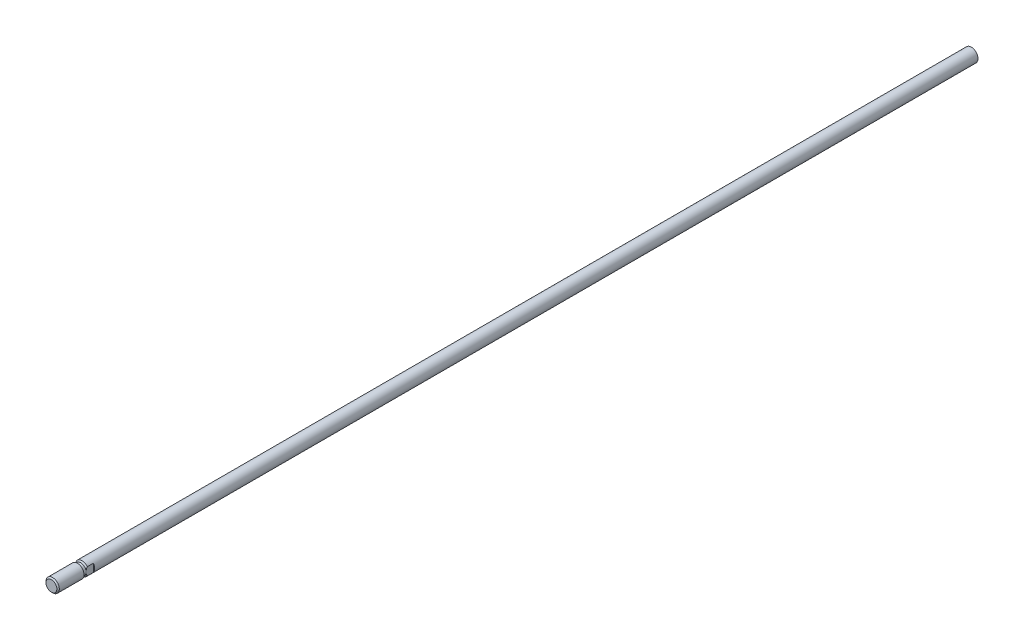
ISO-10303-21;
HEADER;
FILE_DESCRIPTION(('STEP AP214'),'2;1');
FILE_NAME('part.step','',(''),(''),'','','');
FILE_SCHEMA(('AUTOMOTIVE_DESIGN { 1 0 10303 214 1 1 1 1 }'));
ENDSEC;
DATA;
#1=APPLICATION_CONTEXT('core data for automotive mechanical design processes');
#2=APPLICATION_PROTOCOL_DEFINITION('international standard','automotive_design',2000,#1);
#3=PRODUCT_CONTEXT('',#1,'mechanical');
#4=PRODUCT('Part','Part','',(#3));
#5=PRODUCT_RELATED_PRODUCT_CATEGORY('part','',(#4));
#6=PRODUCT_DEFINITION_FORMATION('','',#4);
#7=PRODUCT_DEFINITION_CONTEXT('part definition',#1,'design');
#8=PRODUCT_DEFINITION('design','',#6,#7);
#9=PRODUCT_DEFINITION_SHAPE('','',#8);
#10=(LENGTH_UNIT() NAMED_UNIT(*) SI_UNIT(.MILLI.,.METRE.));
#11=(NAMED_UNIT(*) PLANE_ANGLE_UNIT() SI_UNIT($,.RADIAN.));
#12=(NAMED_UNIT(*) SI_UNIT($,.STERADIAN.) SOLID_ANGLE_UNIT());
#13=UNCERTAINTY_MEASURE_WITH_UNIT(LENGTH_MEASURE(1.E-05),#10,'distance_accuracy_value','');
#14=(GEOMETRIC_REPRESENTATION_CONTEXT(3) GLOBAL_UNCERTAINTY_ASSIGNED_CONTEXT((#13)) GLOBAL_UNIT_ASSIGNED_CONTEXT((#10,
#11,#12)) REPRESENTATION_CONTEXT('',''));
#15=CARTESIAN_POINT('',(0.,0.,0.));
#16=DIRECTION('',(0.,0.,1.));
#17=DIRECTION('',(1.,0.,0.));
#18=AXIS2_PLACEMENT_3D('',#15,#16,#17);
#19=CARTESIAN_POINT('',(-5.10028127481731,-2.99999999999999,12.5));
#20=CARTESIAN_POINT('',(-5.00999999999999,-2.99999999999999,12.5));
#21=CARTESIAN_POINT('',(-4.99999999999999,-2.99999999999999,12.5));
#22=CARTESIAN_POINT('',(-4.,-2.99999999999999,12.5));
#23=B_SPLINE_CURVE_WITH_KNOTS('',1,(#19,#20,#21,#22),.UNSPECIFIED.,.F.,.F.,(2,1,1,2),
(-0.100281274817329,-0.01,0.,1.),.UNSPECIFIED.);
#24=DIRECTION('',(0.,1.,0.));
#25=VECTOR('',#24,1.);
#26=SURFACE_OF_LINEAR_EXTRUSION('',#23,#25);
#27=CARTESIAN_POINT('',(0.,0.,12.5));
#28=DIRECTION('',(0.,0.,1.));
#29=DIRECTION('',(1.,0.,0.));
#30=AXIS2_PLACEMENT_3D('',#27,#28,#29);
#31=CIRCLE('',#30,5.);
#32=CARTESIAN_POINT('',(-4.,-2.99999999999999,12.5));
#33=VERTEX_POINT('',#32);
#34=CARTESIAN_POINT('',(-4.,2.99999999999999,12.5));
#35=VERTEX_POINT('',#34);
#36=EDGE_CURVE('E20',#33,#35,#31,.F.);
#37=ORIENTED_EDGE('',*,*,#36,.F.);
#38=DIRECTION('',(0.,-1.,0.));
#39=VECTOR('',#38,1.);
#40=CARTESIAN_POINT('',(-4.,0.,12.5));
#41=LINE('',#40,#39);
#42=EDGE_CURVE('E75',#35,#33,#41,.T.);
#43=ORIENTED_EDGE('',*,*,#42,.F.);
#44=EDGE_LOOP('',(#37,#43));
#45=FACE_BOUND('',#44,.T.);
#46=ADVANCED_FACE('F16',(#45),#26,.T.);
#47=CARTESIAN_POINT('',(4.,-2.99999999999999,12.5));
#48=CARTESIAN_POINT('',(4.99999999999999,-2.99999999999999,12.5));
#49=CARTESIAN_POINT('',(5.00999999999999,-2.99999999999999,12.5));
#50=CARTESIAN_POINT('',(5.10028127481732,-2.99999999999999,12.5));
#51=B_SPLINE_CURVE_WITH_KNOTS('',1,(#47,#48,#49,#50),.UNSPECIFIED.,.F.,.F.,(2,1,1,2),(0.,1.,
1.01,1.10028127481733),.UNSPECIFIED.);
#52=DIRECTION('',(0.,1.,0.));
#53=VECTOR('',#52,1.);
#54=SURFACE_OF_LINEAR_EXTRUSION('',#51,#53);
#55=CARTESIAN_POINT('',(0.,0.,12.5));
#56=DIRECTION('',(0.,0.,1.));
#57=DIRECTION('',(1.,0.,0.));
#58=AXIS2_PLACEMENT_3D('',#55,#56,#57);
#59=CIRCLE('',#58,5.);
#60=CARTESIAN_POINT('',(4.,2.99999999999999,12.5));
#61=VERTEX_POINT('',#60);
#62=CARTESIAN_POINT('',(4.,-2.99999999999999,12.5));
#63=VERTEX_POINT('',#62);
#64=EDGE_CURVE('E204',#61,#63,#59,.F.);
#65=ORIENTED_EDGE('',*,*,#64,.F.);
#66=DIRECTION('',(0.,1.,0.));
#67=VECTOR('',#66,1.);
#68=CARTESIAN_POINT('',(4.,0.,12.5));
#69=LINE('',#68,#67);
#70=EDGE_CURVE('E104',#63,#61,#69,.T.);
#71=ORIENTED_EDGE('',*,*,#70,.F.);
#72=EDGE_LOOP('',(#65,#71));
#73=FACE_BOUND('',#72,.T.);
#74=ADVANCED_FACE('F114',(#73),#54,.T.);
#75=CARTESIAN_POINT('',(5.06000210822772,4.99999999999999,-651.));
#76=DIRECTION('',(0.,0.,-1.));
#77=DIRECTION('',(0.,-1.,0.));
#78=AXIS2_PLACEMENT_3D('',#75,#76,#77);
#79=PLANE('',#78);
#80=CARTESIAN_POINT('',(0.,0.,-651.));
#81=DIRECTION('',(0.,0.,1.));
#82=DIRECTION('',(1.,0.,0.));
#83=AXIS2_PLACEMENT_3D('',#80,#81,#82);
#84=CIRCLE('',#83,5.);
#85=CARTESIAN_POINT('',(5.,0.,-651.));
#86=VERTEX_POINT('',#85);
#87=EDGE_CURVE('E145',#86,#86,#84,.T.);
#88=ORIENTED_EDGE('',*,*,#87,.F.);
#89=EDGE_LOOP('',(#88));
#90=FACE_BOUND('',#89,.T.);
#91=ADVANCED_FACE('F117',(#90),#79,.T.);
#92=CARTESIAN_POINT('',(-4.,-3.,18.1));
#93=DIRECTION('',(-1.,0.,0.));
#94=DIRECTION('',(0.,1.,0.));
#95=AXIS2_PLACEMENT_3D('',#92,#93,#94);
#96=PLANE('',#95);
#97=DIRECTION('',(0.,0.,-1.));
#98=VECTOR('',#97,1.);
#99=CARTESIAN_POINT('',(-4.,-2.99999999999999,-316.96));
#100=LINE('',#99,#98);
#101=CARTESIAN_POINT('',(-4.,-2.99999999999999,17.0799999999999));
#102=VERTEX_POINT('',#101);
#103=EDGE_CURVE('E80',#102,#33,#100,.T.);
#104=ORIENTED_EDGE('',*,*,#103,.F.);
#105=CARTESIAN_POINT('',(-4.,-0.803990049689661,18.));
#106=CARTESIAN_POINT('',(-4.,-0.957111448979984,17.9698555146944));
#107=CARTESIAN_POINT('',(-4.,-1.10840660638674,17.9317202771459));
#108=CARTESIAN_POINT('',(-4.,-1.40666504289202,17.8422446055734));
#109=CARTESIAN_POINT('',(-4.,-1.55363824050656,17.7909375518835));
#110=CARTESIAN_POINT('',(-4.,-1.84204129733348,17.678225960682));
#111=CARTESIAN_POINT('',(-4.,-1.98350914114274,17.6169164540391));
#112=CARTESIAN_POINT('',(-4.,-2.26263332343884,17.4860572225992));
#113=CARTESIAN_POINT('',(-4.,-2.40028783630364,17.4165036322937));
#114=CARTESIAN_POINT('',(-4.,-2.61449057624326,17.3018001479764));
#115=CARTESIAN_POINT('',(-4.,-2.69220805886646,17.2588026968617));
#116=CARTESIAN_POINT('',(-4.,-2.84678216232171,17.1708112513772));
#117=CARTESIAN_POINT('',(-4.,-2.92363591149713,17.1258122063226));
#118=CARTESIAN_POINT('',(-4.,-3.00000000000003,17.08));
#119=B_SPLINE_CURVE_WITH_KNOTS('',3,(#105,#106,#107,#108,#109,#110,#111,#112,#113,#114,#115,
#116,#117,#118),.UNSPECIFIED.,.F.,.F.,(4,2,2,2,2,2,4),(0.,0.467610349242256,0.934047169800779,
1.39628615872664,1.85874274734352,2.12517735583835,2.39232733289763),.UNSPECIFIED.);
#120=CARTESIAN_POINT('',(-4.,-0.80399004968966,18.));
#121=VERTEX_POINT('',#120);
#122=EDGE_CURVE('E130',#121,#102,#119,.T.);
#123=ORIENTED_EDGE('',*,*,#122,.F.);
#124=DIRECTION('',(0.,0.,-1.));
#125=VECTOR('',#124,1.);
#126=CARTESIAN_POINT('',(-4.,-0.80399004968966,18.1));
#127=LINE('',#126,#125);
#128=CARTESIAN_POINT('',(-4.,-0.803990049689667,18.1));
#129=VERTEX_POINT('',#128);
#130=EDGE_CURVE('E100',#121,#129,#127,.F.);
#131=ORIENTED_EDGE('',*,*,#130,.T.);
#132=DIRECTION('',(0.,1.,0.));
#133=VECTOR('',#132,1.);
#134=CARTESIAN_POINT('',(-4.,-0.80399004968966,18.1));
#135=LINE('',#134,#133);
#136=CARTESIAN_POINT('',(-4.,0.803990049689667,18.1));
#137=VERTEX_POINT('',#136);
#138=EDGE_CURVE('E144',#137,#129,#135,.F.);
#139=ORIENTED_EDGE('',*,*,#138,.F.);
#140=DIRECTION('',(0.,0.,-1.));
#141=VECTOR('',#140,1.);
#142=CARTESIAN_POINT('',(-4.,0.80399004968966,18.1));
#143=LINE('',#142,#141);
#144=CARTESIAN_POINT('',(-4.,0.803990049689661,18.));
#145=VERTEX_POINT('',#144);
#146=EDGE_CURVE('E81',#137,#145,#143,.T.);
#147=ORIENTED_EDGE('',*,*,#146,.T.);
#148=CARTESIAN_POINT('',(-4.,3.,17.0799999999999));
#149=CARTESIAN_POINT('',(-4.,2.91433318955761,17.1313884617042));
#150=CARTESIAN_POINT('',(-4.,2.82804651332608,17.1817624196025));
#151=CARTESIAN_POINT('',(-4.,2.65408101451074,17.2801077499734));
#152=CARTESIAN_POINT('',(-4.,2.5664017630611,17.3280783626319));
#153=CARTESIAN_POINT('',(-4.,2.3902024009373,17.4208683269221));
#154=CARTESIAN_POINT('',(-4.,2.30169320984052,17.465708251827));
#155=CARTESIAN_POINT('',(-4.,2.12311651376085,17.5521398631163));
#156=CARTESIAN_POINT('',(-4.,2.03304902327721,17.5937315797039));
#157=CARTESIAN_POINT('',(-4.,1.75985168179281,17.7130582155985));
#158=CARTESIAN_POINT('',(-4.,1.57412824469786,17.7851279795312));
#159=CARTESIAN_POINT('',(-4.,1.19469510076659,17.9092721171055));
#160=CARTESIAN_POINT('',(-4.,1.00093669700268,17.9611955066744));
#161=CARTESIAN_POINT('',(-4.,0.803990049689665,18.));
#162=B_SPLINE_CURVE_WITH_KNOTS('',3,(#148,#149,#150,#151,#152,#153,#154,#155,#156,#157,#158,
#159,#160,#161),.UNSPECIFIED.,.F.,.F.,(4,2,2,2,2,2,4),(0.,0.299699796219322,0.599493751801352,
0.897083854470931,1.19467118968738,1.79121084839557,2.39213860279033),.UNSPECIFIED.);
#163=CARTESIAN_POINT('',(-4.,2.99999999999999,17.0799999999999));
#164=VERTEX_POINT('',#163);
#165=EDGE_CURVE('E89',#164,#145,#162,.T.);
#166=ORIENTED_EDGE('',*,*,#165,.F.);
#167=DIRECTION('',(0.,0.,1.));
#168=VECTOR('',#167,1.);
#169=CARTESIAN_POINT('',(-4.,2.99999999999999,-316.96));
#170=LINE('',#169,#168);
#171=EDGE_CURVE('E85',#35,#164,#170,.T.);
#172=ORIENTED_EDGE('',*,*,#171,.F.);
#173=ORIENTED_EDGE('',*,*,#42,.T.);
#174=EDGE_LOOP('',(#104,#123,#131,#139,#147,#166,#172,#173));
#175=FACE_BOUND('',#174,.T.);
#176=ADVANCED_FACE('F86',(#175),#96,.T.);
#177=CARTESIAN_POINT('',(4.,3.,18.1));
#178=DIRECTION('',(1.,0.,0.));
#179=DIRECTION('',(0.,-1.,0.));
#180=AXIS2_PLACEMENT_3D('',#177,#178,#179);
#181=PLANE('',#180);
#182=DIRECTION('',(0.,0.,-1.));
#183=VECTOR('',#182,1.);
#184=CARTESIAN_POINT('',(4.,2.99999999999999,-316.96));
#185=LINE('',#184,#183);
#186=CARTESIAN_POINT('',(4.,2.99999999999999,17.0799999999999));
#187=VERTEX_POINT('',#186);
#188=EDGE_CURVE('E106',#187,#61,#185,.T.);
#189=ORIENTED_EDGE('',*,*,#188,.F.);
#190=CARTESIAN_POINT('',(4.,0.80399004968966,18.));
#191=CARTESIAN_POINT('',(4.,0.957111448979982,17.9698555146944));
#192=CARTESIAN_POINT('',(4.,1.10840660638673,17.9317202771459));
#193=CARTESIAN_POINT('',(4.,1.40666504289201,17.8422446055734));
#194=CARTESIAN_POINT('',(4.,1.55363824050656,17.7909375518835));
#195=CARTESIAN_POINT('',(4.,1.84204129733348,17.678225960682));
#196=CARTESIAN_POINT('',(4.,1.98350914114274,17.6169164540391));
#197=CARTESIAN_POINT('',(4.,2.26263332343884,17.4860572225992));
#198=CARTESIAN_POINT('',(4.,2.40028783630364,17.4165036322937));
#199=CARTESIAN_POINT('',(4.,2.61449057624326,17.3018001479764));
#200=CARTESIAN_POINT('',(4.,2.69220805886646,17.2588026968617));
#201=CARTESIAN_POINT('',(4.,2.84678216232171,17.1708112513772));
#202=CARTESIAN_POINT('',(4.,2.92363591149713,17.1258122063226));
#203=CARTESIAN_POINT('',(4.,3.00000000000002,17.08));
#204=B_SPLINE_CURVE_WITH_KNOTS('',3,(#190,#191,#192,#193,#194,#195,#196,#197,#198,#199,#200,
#201,#202,#203),.UNSPECIFIED.,.F.,.F.,(4,2,2,2,2,2,4),(0.,0.467610349242256,0.934047169800778,
1.39628615872664,1.85874274734352,2.12517735583835,2.39232733289763),.UNSPECIFIED.);
#205=CARTESIAN_POINT('',(4.,0.80399004968966,18.));
#206=VERTEX_POINT('',#205);
#207=EDGE_CURVE('E158',#206,#187,#204,.T.);
#208=ORIENTED_EDGE('',*,*,#207,.F.);
#209=DIRECTION('',(0.,0.,-1.));
#210=VECTOR('',#209,1.);
#211=CARTESIAN_POINT('',(4.,0.80399004968966,18.1));
#212=LINE('',#211,#210);
#213=CARTESIAN_POINT('',(4.,0.803990049689667,18.1));
#214=VERTEX_POINT('',#213);
#215=EDGE_CURVE('E35',#206,#214,#212,.F.);
#216=ORIENTED_EDGE('',*,*,#215,.T.);
#217=DIRECTION('',(0.,1.,0.));
#218=VECTOR('',#217,1.);
#219=CARTESIAN_POINT('',(4.,-0.80399004968966,18.1));
#220=LINE('',#219,#218);
#221=CARTESIAN_POINT('',(4.,-0.803990049689667,18.1));
#222=VERTEX_POINT('',#221);
#223=EDGE_CURVE('E166',#222,#214,#220,.T.);
#224=ORIENTED_EDGE('',*,*,#223,.F.);
#225=DIRECTION('',(0.,0.,-1.));
#226=VECTOR('',#225,1.);
#227=CARTESIAN_POINT('',(4.,-0.80399004968966,18.1));
#228=LINE('',#227,#226);
#229=CARTESIAN_POINT('',(4.,-0.80399004968966,18.));
#230=VERTEX_POINT('',#229);
#231=EDGE_CURVE('E107',#222,#230,#228,.T.);
#232=ORIENTED_EDGE('',*,*,#231,.T.);
#233=CARTESIAN_POINT('',(4.,-3.,17.0799999999999));
#234=CARTESIAN_POINT('',(4.,-2.91433318955761,17.1313884617042));
#235=CARTESIAN_POINT('',(4.,-2.82804651332608,17.1817624196025));
#236=CARTESIAN_POINT('',(4.,-2.65408101451074,17.2801077499734));
#237=CARTESIAN_POINT('',(4.,-2.5664017630611,17.3280783626319));
#238=CARTESIAN_POINT('',(4.,-2.3902024009373,17.4208683269221));
#239=CARTESIAN_POINT('',(4.,-2.30169320984052,17.465708251827));
#240=CARTESIAN_POINT('',(4.,-2.12311651376084,17.5521398631163));
#241=CARTESIAN_POINT('',(4.,-2.03304902327721,17.5937315797039));
#242=CARTESIAN_POINT('',(4.,-1.75985168179281,17.7130582155985));
#243=CARTESIAN_POINT('',(4.,-1.57412824469786,17.7851279795312));
#244=CARTESIAN_POINT('',(4.,-1.19469510076659,17.9092721171055));
#245=CARTESIAN_POINT('',(4.,-1.00093669700268,17.9611955066744));
#246=CARTESIAN_POINT('',(4.,-0.803990049689663,18.));
#247=B_SPLINE_CURVE_WITH_KNOTS('',3,(#233,#234,#235,#236,#237,#238,#239,#240,#241,#242,#243,
#244,#245,#246),.UNSPECIFIED.,.F.,.F.,(4,2,2,2,2,2,4),(0.,0.299699796219322,0.599493751801353,
0.897083854470931,1.19467118968738,1.79121084839557,2.39213860279033),.UNSPECIFIED.);
#248=CARTESIAN_POINT('',(4.,-2.99999999999999,17.0799999999999));
#249=VERTEX_POINT('',#248);
#250=EDGE_CURVE('E169',#249,#230,#247,.T.);
#251=ORIENTED_EDGE('',*,*,#250,.F.);
#252=DIRECTION('',(0.,0.,1.));
#253=VECTOR('',#252,1.);
#254=CARTESIAN_POINT('',(4.,-2.99999999999999,-316.96));
#255=LINE('',#254,#253);
#256=EDGE_CURVE('E98',#63,#249,#255,.T.);
#257=ORIENTED_EDGE('',*,*,#256,.F.);
#258=ORIENTED_EDGE('',*,*,#70,.T.);
#259=EDGE_LOOP('',(#189,#208,#216,#224,#232,#251,#257,#258));
#260=FACE_BOUND('',#259,.T.);
#261=ADVANCED_FACE('F125',(#260),#181,.T.);
#262=CARTESIAN_POINT('',(0.,0.,17.0799999999999));
#263=DIRECTION('',(0.,0.,1.));
#264=DIRECTION('',(1.,0.,0.));
#265=AXIS2_PLACEMENT_3D('',#262,#263,#264);
#266=CYLINDRICAL_SURFACE('',#265,5.);
#267=ORIENTED_EDGE('',*,*,#171,.T.);
#268=CARTESIAN_POINT('',(0.,0.,17.0799999999999));
#269=DIRECTION('',(0.,0.,1.));
#270=DIRECTION('',(0.,1.,0.));
#271=AXIS2_PLACEMENT_3D('',#268,#269,#270);
#272=CIRCLE('',#271,5.);
#273=EDGE_CURVE('E165',#187,#164,#272,.T.);
#274=ORIENTED_EDGE('',*,*,#273,.F.);
#275=ORIENTED_EDGE('',*,*,#188,.T.);
#276=ORIENTED_EDGE('',*,*,#64,.T.);
#277=ORIENTED_EDGE('',*,*,#256,.T.);
#278=CARTESIAN_POINT('',(0.,0.,17.0799999999999));
#279=DIRECTION('',(0.,0.,1.));
#280=DIRECTION('',(0.,1.,0.));
#281=AXIS2_PLACEMENT_3D('',#278,#279,#280);
#282=CIRCLE('',#281,5.);
#283=EDGE_CURVE('E175',#102,#249,#282,.T.);
#284=ORIENTED_EDGE('',*,*,#283,.F.);
#285=ORIENTED_EDGE('',*,*,#103,.T.);
#286=ORIENTED_EDGE('',*,*,#36,.T.);
#287=EDGE_LOOP('',(#267,#274,#275,#276,#277,#284,#285,#286));
#288=FACE_BOUND('',#287,.T.);
#289=ORIENTED_EDGE('',*,*,#87,.T.);
#290=EDGE_LOOP('',(#289));
#291=FACE_BOUND('',#290,.T.);
#292=ADVANCED_FACE('F93',(#288,#291),#266,.T.);
#293=CARTESIAN_POINT('',(-4.,-0.80399004968966,18.1));
#294=CARTESIAN_POINT('',(-4.08,-0.80399004968966,18.1));
#295=CARTESIAN_POINT('',(-4.0808,-0.80399004968966,18.1));
#296=B_SPLINE_CURVE_WITH_KNOTS('',1,(#293,#294,#295),.UNSPECIFIED.,.F.,.F.,(2,1,2),(0.,1.,1.01),.UNSPECIFIED.);
#297=DIRECTION('',(0.,1.,0.));
#298=VECTOR('',#297,1.);
#299=SURFACE_OF_LINEAR_EXTRUSION('',#296,#298);
#300=CARTESIAN_POINT('',(0.,0.,18.1));
#301=DIRECTION('',(0.,0.,1.));
#302=DIRECTION('',(1.,0.,0.));
#303=AXIS2_PLACEMENT_3D('',#300,#301,#302);
#304=CIRCLE('',#303,4.08);
#305=EDGE_CURVE('E167',#137,#129,#304,.T.);
#306=ORIENTED_EDGE('',*,*,#305,.F.);
#307=ORIENTED_EDGE('',*,*,#138,.T.);
#308=EDGE_LOOP('',(#306,#307));
#309=FACE_BOUND('',#308,.T.);
#310=ADVANCED_FACE('F180',(#309),#299,.T.);
#311=CARTESIAN_POINT('',(0.,0.,18.));
#312=DIRECTION('',(0.,0.,-1.));
#313=DIRECTION('',(-1.,0.,0.));
#314=AXIS2_PLACEMENT_3D('',#311,#312,#313);
#315=CONICAL_SURFACE('',#314,4.08,0.785398163397408);
#316=ORIENTED_EDGE('',*,*,#250,.T.);
#317=CARTESIAN_POINT('',(0.,0.,18.));
#318=DIRECTION('',(0.,0.,1.));
#319=DIRECTION('',(0.,1.,0.));
#320=AXIS2_PLACEMENT_3D('',#317,#318,#319);
#321=CIRCLE('',#320,4.08);
#322=EDGE_CURVE('E211',#121,#230,#321,.T.);
#323=ORIENTED_EDGE('',*,*,#322,.F.);
#324=ORIENTED_EDGE('',*,*,#122,.T.);
#325=ORIENTED_EDGE('',*,*,#283,.T.);
#326=EDGE_LOOP('',(#316,#323,#324,#325));
#327=FACE_BOUND('',#326,.T.);
#328=ADVANCED_FACE('F176',(#327),#315,.T.);
#329=CARTESIAN_POINT('',(4.0808,-0.80399004968966,18.1));
#330=CARTESIAN_POINT('',(4.08,-0.80399004968966,18.1));
#331=CARTESIAN_POINT('',(4.,-0.80399004968966,18.1));
#332=B_SPLINE_CURVE_WITH_KNOTS('',1,(#329,#330,#331),.UNSPECIFIED.,.F.,.F.,(2,1,2),(-0.01,0.,
1.),.UNSPECIFIED.);
#333=DIRECTION('',(0.,1.,0.));
#334=VECTOR('',#333,1.);
#335=SURFACE_OF_LINEAR_EXTRUSION('',#332,#334);
#336=CARTESIAN_POINT('',(0.,0.,18.1));
#337=DIRECTION('',(0.,0.,1.));
#338=DIRECTION('',(1.,0.,0.));
#339=AXIS2_PLACEMENT_3D('',#336,#337,#338);
#340=CIRCLE('',#339,4.08);
#341=EDGE_CURVE('E217',#222,#214,#340,.T.);
#342=ORIENTED_EDGE('',*,*,#341,.F.);
#343=ORIENTED_EDGE('',*,*,#223,.T.);
#344=EDGE_LOOP('',(#342,#343));
#345=FACE_BOUND('',#344,.T.);
#346=ADVANCED_FACE('F152',(#345),#335,.T.);
#347=CARTESIAN_POINT('',(0.,0.,18.));
#348=DIRECTION('',(0.,0.,-1.));
#349=DIRECTION('',(-1.,0.,0.));
#350=AXIS2_PLACEMENT_3D('',#347,#348,#349);
#351=CONICAL_SURFACE('',#350,4.08,0.785398163397408);
#352=ORIENTED_EDGE('',*,*,#207,.T.);
#353=ORIENTED_EDGE('',*,*,#273,.T.);
#354=ORIENTED_EDGE('',*,*,#165,.T.);
#355=CARTESIAN_POINT('',(0.,0.,18.));
#356=DIRECTION('',(0.,0.,1.));
#357=DIRECTION('',(0.,1.,0.));
#358=AXIS2_PLACEMENT_3D('',#355,#356,#357);
#359=CIRCLE('',#358,4.08);
#360=EDGE_CURVE('E220',#206,#145,#359,.T.);
#361=ORIENTED_EDGE('',*,*,#360,.F.);
#362=EDGE_LOOP('',(#352,#353,#354,#361));
#363=FACE_BOUND('',#362,.T.);
#364=ADVANCED_FACE('F146',(#363),#351,.T.);
#365=CARTESIAN_POINT('',(0.,0.,20.5));
#366=DIRECTION('',(0.,0.,1.));
#367=DIRECTION('',(1.,0.,0.));
#368=AXIS2_PLACEMENT_3D('',#365,#366,#367);
#369=CYLINDRICAL_SURFACE('',#368,4.08);
#370=CARTESIAN_POINT('',(0.,0.,20.5));
#371=DIRECTION('',(0.,0.,1.));
#372=DIRECTION('',(1.,0.,0.));
#373=AXIS2_PLACEMENT_3D('',#370,#371,#372);
#374=CIRCLE('',#373,4.08);
#375=CARTESIAN_POINT('',(4.08,0.,20.5));
#376=VERTEX_POINT('',#375);
#377=EDGE_CURVE('E224',#376,#376,#374,.T.);
#378=ORIENTED_EDGE('',*,*,#377,.F.);
#379=EDGE_LOOP('',(#378));
#380=FACE_BOUND('',#379,.T.);
#381=ORIENTED_EDGE('',*,*,#215,.F.);
#382=ORIENTED_EDGE('',*,*,#360,.T.);
#383=ORIENTED_EDGE('',*,*,#146,.F.);
#384=ORIENTED_EDGE('',*,*,#305,.T.);
#385=ORIENTED_EDGE('',*,*,#130,.F.);
#386=ORIENTED_EDGE('',*,*,#322,.T.);
#387=ORIENTED_EDGE('',*,*,#231,.F.);
#388=ORIENTED_EDGE('',*,*,#341,.T.);
#389=EDGE_LOOP('',(#381,#382,#383,#384,#385,#386,#387,#388));
#390=FACE_BOUND('',#389,.T.);
#391=ADVANCED_FACE('F151',(#380,#390),#369,.T.);
#392=CARTESIAN_POINT('',(5.06000210821954,4.99999999999999,20.5));
#393=DIRECTION('',(0.,0.,-1.));
#394=DIRECTION('',(0.,-1.,0.));
#395=AXIS2_PLACEMENT_3D('',#392,#393,#394);
#396=PLANE('',#395);
#397=ORIENTED_EDGE('',*,*,#377,.T.);
#398=EDGE_LOOP('',(#397));
#399=FACE_BOUND('',#398,.T.);
#400=CARTESIAN_POINT('',(0.,0.,20.5));
#401=DIRECTION('',(0.,0.,1.));
#402=DIRECTION('',(1.,0.,0.));
#403=AXIS2_PLACEMENT_3D('',#400,#401,#402);
#404=CIRCLE('',#403,5.);
#405=CARTESIAN_POINT('',(5.,0.,20.5));
#406=VERTEX_POINT('',#405);
#407=EDGE_CURVE('E227',#406,#406,#404,.T.);
#408=ORIENTED_EDGE('',*,*,#407,.F.);
#409=EDGE_LOOP('',(#408));
#410=FACE_BOUND('',#409,.T.);
#411=ADVANCED_FACE('F256',(#399,#410),#396,.T.);
#412=CARTESIAN_POINT('',(0.,0.,39.0799999999997));
#413=DIRECTION('',(0.,0.,1.));
#414=DIRECTION('',(1.,0.,0.));
#415=AXIS2_PLACEMENT_3D('',#412,#413,#414);
#416=CYLINDRICAL_SURFACE('',#415,5.);
#417=ORIENTED_EDGE('',*,*,#407,.T.);
#418=EDGE_LOOP('',(#417));
#419=FACE_BOUND('',#418,.T.);
#420=CARTESIAN_POINT('',(0.,0.,39.0799999999997));
#421=DIRECTION('',(0.,0.,1.));
#422=DIRECTION('',(0.,1.,0.));
#423=AXIS2_PLACEMENT_3D('',#420,#421,#422);
#424=CIRCLE('',#423,5.);
#425=CARTESIAN_POINT('',(0.,5.,39.0799999999997));
#426=VERTEX_POINT('',#425);
#427=EDGE_CURVE('E26',#426,#426,#424,.T.);
#428=ORIENTED_EDGE('',*,*,#427,.F.);
#429=EDGE_LOOP('',(#428));
#430=FACE_BOUND('',#429,.T.);
#431=ADVANCED_FACE('F253',(#419,#430),#416,.T.);
#432=CARTESIAN_POINT('',(4.12896210820034,-4.08,40.));
#433=DIRECTION('',(0.,0.,1.));
#434=DIRECTION('',(0.,1.,0.));
#435=AXIS2_PLACEMENT_3D('',#432,#433,#434);
#436=PLANE('',#435);
#437=CARTESIAN_POINT('',(0.,0.,40.));
#438=DIRECTION('',(0.,0.,-1.));
#439=DIRECTION('',(-1.,0.,0.));
#440=AXIS2_PLACEMENT_3D('',#437,#438,#439);
#441=CIRCLE('',#440,4.08);
#442=CARTESIAN_POINT('',(-4.08,0.,40.));
#443=VERTEX_POINT('',#442);
#444=EDGE_CURVE('E11',#443,#443,#441,.T.);
#445=ORIENTED_EDGE('',*,*,#444,.F.);
#446=EDGE_LOOP('',(#445));
#447=FACE_BOUND('',#446,.T.);
#448=ADVANCED_FACE('F255',(#447),#436,.T.);
#449=CARTESIAN_POINT('',(0.,0.,40.));
#450=DIRECTION('',(0.,0.,-1.));
#451=DIRECTION('',(-1.,0.,0.));
#452=AXIS2_PLACEMENT_3D('',#449,#450,#451);
#453=CONICAL_SURFACE('',#452,4.08,0.785398163397287);
#454=ORIENTED_EDGE('',*,*,#444,.T.);
#455=EDGE_LOOP('',(#454));
#456=FACE_BOUND('',#455,.T.);
#457=ORIENTED_EDGE('',*,*,#427,.T.);
#458=EDGE_LOOP('',(#457));
#459=FACE_BOUND('',#458,.T.);
#460=ADVANCED_FACE('F251',(#456,#459),#453,.T.);
#461=CLOSED_SHELL('',(#46,#74,#91,#176,#261,#292,#310,#328,#346,#364,#391,#411,#431,#448,#460));
#462=MANIFOLD_SOLID_BREP('B1',#461);
#463=ADVANCED_BREP_SHAPE_REPRESENTATION('',(#18,#462),#14);
#464=SHAPE_DEFINITION_REPRESENTATION(#9,#463);
ENDSEC;
END-ISO-10303-21;
